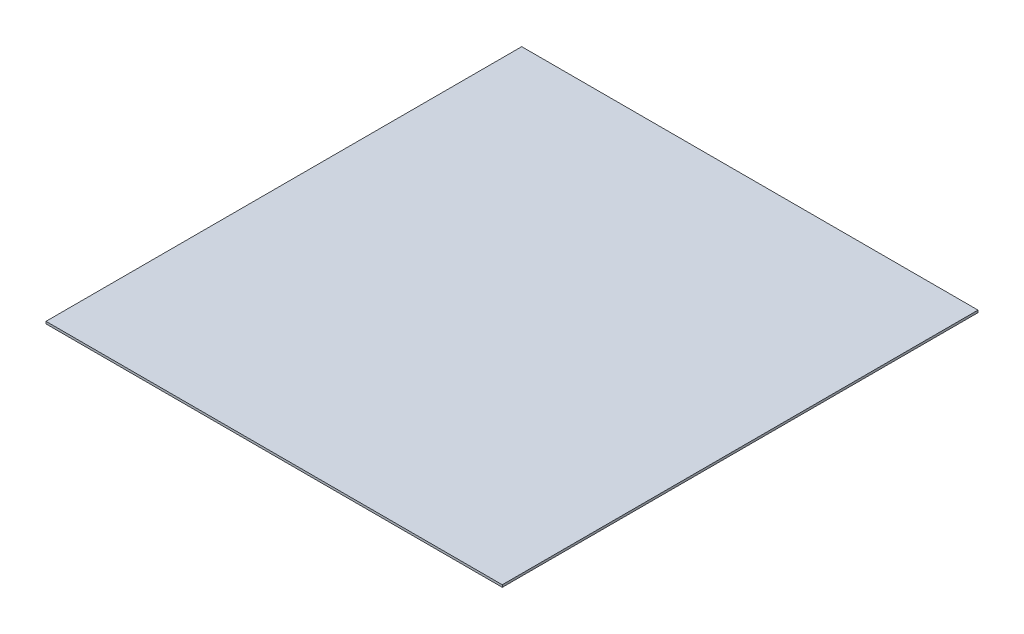
ISO-10303-21;
HEADER;
FILE_DESCRIPTION(('STEP AP214'),'2;1');
FILE_NAME('part.step','',(''),(''),'','','');
FILE_SCHEMA(('AUTOMOTIVE_DESIGN { 1 0 10303 214 1 1 1 1 }'));
ENDSEC;
DATA;
#1=APPLICATION_CONTEXT('core data for automotive mechanical design processes');
#2=APPLICATION_PROTOCOL_DEFINITION('international standard','automotive_design',2000,#1);
#3=PRODUCT_CONTEXT('',#1,'mechanical');
#4=PRODUCT('Part','Part','',(#3));
#5=PRODUCT_RELATED_PRODUCT_CATEGORY('part','',(#4));
#6=PRODUCT_DEFINITION_FORMATION('','',#4);
#7=PRODUCT_DEFINITION_CONTEXT('part definition',#1,'design');
#8=PRODUCT_DEFINITION('design','',#6,#7);
#9=PRODUCT_DEFINITION_SHAPE('','',#8);
#10=(LENGTH_UNIT() NAMED_UNIT(*) SI_UNIT(.MILLI.,.METRE.));
#11=(NAMED_UNIT(*) PLANE_ANGLE_UNIT() SI_UNIT($,.RADIAN.));
#12=(NAMED_UNIT(*) SI_UNIT($,.STERADIAN.) SOLID_ANGLE_UNIT());
#13=UNCERTAINTY_MEASURE_WITH_UNIT(LENGTH_MEASURE(1.E-05),#10,'distance_accuracy_value','');
#14=(GEOMETRIC_REPRESENTATION_CONTEXT(3) GLOBAL_UNCERTAINTY_ASSIGNED_CONTEXT((#13)) GLOBAL_UNIT_ASSIGNED_CONTEXT((#10,
#11,#12)) REPRESENTATION_CONTEXT('',''));
#15=CARTESIAN_POINT('',(0.,0.,0.));
#16=DIRECTION('',(0.,0.,1.));
#17=DIRECTION('',(1.,0.,0.));
#18=AXIS2_PLACEMENT_3D('',#15,#16,#17);
#19=CARTESIAN_POINT('',(0.,0.,0.));
#20=DIRECTION('',(0.,1.,0.));
#21=DIRECTION('',(0.,0.,1.));
#22=AXIS2_PLACEMENT_3D('',#19,#20,#21);
#23=PLANE('',#22);
#24=DIRECTION('',(0.,0.,1.));
#25=VECTOR('',#24,1.);
#26=CARTESIAN_POINT('',(-14.,0.,-183.5));
#27=LINE('',#26,#25);
#28=CARTESIAN_POINT('',(-14.,0.,-183.5));
#29=VERTEX_POINT('',#28);
#30=CARTESIAN_POINT('',(-14.,0.,-181.75));
#31=VERTEX_POINT('',#30);
#32=EDGE_CURVE('E53',#29,#31,#27,.T.);
#33=ORIENTED_EDGE('',*,*,#32,.F.);
#34=DIRECTION('',(-1.,0.,0.));
#35=VECTOR('',#34,1.);
#36=CARTESIAN_POINT('',(-176.,0.,-183.5));
#37=LINE('',#36,#35);
#38=CARTESIAN_POINT('',(176.,0.,-183.5));
#39=VERTEX_POINT('',#38);
#40=EDGE_CURVE('E115',#39,#29,#37,.T.);
#41=ORIENTED_EDGE('',*,*,#40,.F.);
#42=DIRECTION('',(0.,0.,-1.));
#43=VECTOR('',#42,1.);
#44=CARTESIAN_POINT('',(176.,0.,-183.5));
#45=LINE('',#44,#43);
#46=CARTESIAN_POINT('',(176.,0.,183.5));
#47=VERTEX_POINT('',#46);
#48=EDGE_CURVE('E112',#47,#39,#45,.T.);
#49=ORIENTED_EDGE('',*,*,#48,.F.);
#50=DIRECTION('',(1.,0.,0.));
#51=VECTOR('',#50,1.);
#52=CARTESIAN_POINT('',(-176.,0.,183.5));
#53=LINE('',#52,#51);
#54=CARTESIAN_POINT('',(-176.,0.,183.5));
#55=VERTEX_POINT('',#54);
#56=EDGE_CURVE('E125',#55,#47,#53,.T.);
#57=ORIENTED_EDGE('',*,*,#56,.F.);
#58=DIRECTION('',(0.,0.,1.));
#59=VECTOR('',#58,1.);
#60=CARTESIAN_POINT('',(-176.,0.,-183.5));
#61=LINE('',#60,#59);
#62=CARTESIAN_POINT('',(-176.,0.,-181.75));
#63=VERTEX_POINT('',#62);
#64=EDGE_CURVE('E133',#63,#55,#61,.T.);
#65=ORIENTED_EDGE('',*,*,#64,.F.);
#66=DIRECTION('',(-1.,0.,0.));
#67=VECTOR('',#66,1.);
#68=CARTESIAN_POINT('',(-14.,0.,-181.75));
#69=LINE('',#68,#67);
#70=EDGE_CURVE('E48',#31,#63,#69,.T.);
#71=ORIENTED_EDGE('',*,*,#70,.F.);
#72=EDGE_LOOP('',(#33,#41,#49,#57,#65,#71));
#73=FACE_BOUND('',#72,.T.);
#74=ADVANCED_FACE('F33',(#73),#23,.F.);
#75=CARTESIAN_POINT('',(176.,1.75,-183.5));
#76=DIRECTION('',(-1.,0.,0.));
#77=DIRECTION('',(0.,0.,1.));
#78=AXIS2_PLACEMENT_3D('',#75,#76,#77);
#79=PLANE('',#78);
#80=ORIENTED_EDGE('',*,*,#48,.T.);
#81=DIRECTION('',(0.,-1.,0.));
#82=VECTOR('',#81,1.);
#83=CARTESIAN_POINT('',(176.,1.75,-183.5));
#84=LINE('',#83,#82);
#85=CARTESIAN_POINT('',(176.,1.75,-183.5));
#86=VERTEX_POINT('',#85);
#87=EDGE_CURVE('E11',#86,#39,#84,.T.);
#88=ORIENTED_EDGE('',*,*,#87,.F.);
#89=DIRECTION('',(0.,0.,-1.));
#90=VECTOR('',#89,1.);
#91=CARTESIAN_POINT('',(176.,1.75,-183.5));
#92=LINE('',#91,#90);
#93=CARTESIAN_POINT('',(176.,1.75,183.5));
#94=VERTEX_POINT('',#93);
#95=EDGE_CURVE('E121',#94,#86,#92,.T.);
#96=ORIENTED_EDGE('',*,*,#95,.F.);
#97=DIRECTION('',(0.,-1.,0.));
#98=VECTOR('',#97,1.);
#99=CARTESIAN_POINT('',(176.,1.75,183.5));
#100=LINE('',#99,#98);
#101=EDGE_CURVE('E130',#94,#47,#100,.T.);
#102=ORIENTED_EDGE('',*,*,#101,.T.);
#103=EDGE_LOOP('',(#80,#88,#96,#102));
#104=FACE_BOUND('',#103,.T.);
#105=ADVANCED_FACE('F35',(#104),#79,.F.);
#106=CARTESIAN_POINT('',(-176.,1.75,-183.5));
#107=DIRECTION('',(0.,0.,1.));
#108=DIRECTION('',(1.,0.,0.));
#109=AXIS2_PLACEMENT_3D('',#106,#107,#108);
#110=PLANE('',#109);
#111=ORIENTED_EDGE('',*,*,#40,.T.);
#112=DIRECTION('',(0.,1.,0.));
#113=VECTOR('',#112,1.);
#114=CARTESIAN_POINT('',(-14.,-30.,-183.5));
#115=LINE('',#114,#113);
#116=CARTESIAN_POINT('',(-14.,-30.,-183.5));
#117=VERTEX_POINT('',#116);
#118=EDGE_CURVE('E117',#117,#29,#115,.T.);
#119=ORIENTED_EDGE('',*,*,#118,.F.);
#120=DIRECTION('',(1.,0.,0.));
#121=VECTOR('',#120,1.);
#122=CARTESIAN_POINT('',(-14.,-30.,-183.5));
#123=LINE('',#122,#121);
#124=CARTESIAN_POINT('',(-176.,-30.,-183.5));
#125=VERTEX_POINT('',#124);
#126=EDGE_CURVE('E106',#125,#117,#123,.T.);
#127=ORIENTED_EDGE('',*,*,#126,.F.);
#128=DIRECTION('',(0.,-1.,0.));
#129=VECTOR('',#128,1.);
#130=CARTESIAN_POINT('',(-176.,1.75,-183.5));
#131=LINE('',#130,#129);
#132=CARTESIAN_POINT('',(-176.,1.75,-183.5));
#133=VERTEX_POINT('',#132);
#134=EDGE_CURVE('E41',#133,#125,#131,.T.);
#135=ORIENTED_EDGE('',*,*,#134,.F.);
#136=DIRECTION('',(-1.,0.,0.));
#137=VECTOR('',#136,1.);
#138=CARTESIAN_POINT('',(-176.,1.75,-183.5));
#139=LINE('',#138,#137);
#140=EDGE_CURVE('E124',#86,#133,#139,.T.);
#141=ORIENTED_EDGE('',*,*,#140,.F.);
#142=ORIENTED_EDGE('',*,*,#87,.T.);
#143=EDGE_LOOP('',(#111,#119,#127,#135,#141,#142));
#144=FACE_BOUND('',#143,.T.);
#145=ADVANCED_FACE('F147',(#144),#110,.F.);
#146=CARTESIAN_POINT('',(-176.,1.75,-183.5));
#147=DIRECTION('',(1.,0.,0.));
#148=DIRECTION('',(0.,0.,-1.));
#149=AXIS2_PLACEMENT_3D('',#146,#147,#148);
#150=PLANE('',#149);
#151=ORIENTED_EDGE('',*,*,#134,.T.);
#152=DIRECTION('',(0.,0.,-1.));
#153=VECTOR('',#152,1.);
#154=CARTESIAN_POINT('',(-176.,-30.,-183.5));
#155=LINE('',#154,#153);
#156=CARTESIAN_POINT('',(-176.,-30.,-181.75));
#157=VERTEX_POINT('',#156);
#158=EDGE_CURVE('E100',#157,#125,#155,.T.);
#159=ORIENTED_EDGE('',*,*,#158,.F.);
#160=DIRECTION('',(0.,1.,0.));
#161=VECTOR('',#160,1.);
#162=CARTESIAN_POINT('',(-176.,-30.,-181.75));
#163=LINE('',#162,#161);
#164=EDGE_CURVE('E96',#157,#63,#163,.T.);
#165=ORIENTED_EDGE('',*,*,#164,.T.);
#166=ORIENTED_EDGE('',*,*,#64,.T.);
#167=DIRECTION('',(0.,-1.,0.));
#168=VECTOR('',#167,1.);
#169=CARTESIAN_POINT('',(-176.,1.75,183.5));
#170=LINE('',#169,#168);
#171=CARTESIAN_POINT('',(-176.,1.75,183.5));
#172=VERTEX_POINT('',#171);
#173=EDGE_CURVE('E138',#172,#55,#170,.T.);
#174=ORIENTED_EDGE('',*,*,#173,.F.);
#175=DIRECTION('',(0.,0.,1.));
#176=VECTOR('',#175,1.);
#177=CARTESIAN_POINT('',(-176.,1.75,-183.5));
#178=LINE('',#177,#176);
#179=EDGE_CURVE('E127',#133,#172,#178,.T.);
#180=ORIENTED_EDGE('',*,*,#179,.F.);
#181=EDGE_LOOP('',(#151,#159,#165,#166,#174,#180));
#182=FACE_BOUND('',#181,.T.);
#183=ADVANCED_FACE('F143',(#182),#150,.F.);
#184=CARTESIAN_POINT('',(-176.,1.75,183.5));
#185=DIRECTION('',(0.,0.,-1.));
#186=DIRECTION('',(-1.,0.,0.));
#187=AXIS2_PLACEMENT_3D('',#184,#185,#186);
#188=PLANE('',#187);
#189=ORIENTED_EDGE('',*,*,#56,.T.);
#190=ORIENTED_EDGE('',*,*,#101,.F.);
#191=DIRECTION('',(1.,0.,0.));
#192=VECTOR('',#191,1.);
#193=CARTESIAN_POINT('',(-176.,1.75,183.5));
#194=LINE('',#193,#192);
#195=EDGE_CURVE('E129',#172,#94,#194,.T.);
#196=ORIENTED_EDGE('',*,*,#195,.F.);
#197=ORIENTED_EDGE('',*,*,#173,.T.);
#198=EDGE_LOOP('',(#189,#190,#196,#197));
#199=FACE_BOUND('',#198,.T.);
#200=ADVANCED_FACE('F154',(#199),#188,.F.);
#201=CARTESIAN_POINT('',(0.,1.75,0.));
#202=DIRECTION('',(0.,1.,0.));
#203=DIRECTION('',(0.,0.,1.));
#204=AXIS2_PLACEMENT_3D('',#201,#202,#203);
#205=PLANE('',#204);
#206=ORIENTED_EDGE('',*,*,#95,.T.);
#207=ORIENTED_EDGE('',*,*,#140,.T.);
#208=ORIENTED_EDGE('',*,*,#179,.T.);
#209=ORIENTED_EDGE('',*,*,#195,.T.);
#210=EDGE_LOOP('',(#206,#207,#208,#209));
#211=FACE_BOUND('',#210,.T.);
#212=ADVANCED_FACE('F161',(#211),#205,.T.);
#213=CARTESIAN_POINT('',(-14.,-30.,-183.5));
#214=DIRECTION('',(-1.,0.,0.));
#215=DIRECTION('',(0.,0.,1.));
#216=AXIS2_PLACEMENT_3D('',#213,#214,#215);
#217=PLANE('',#216);
#218=ORIENTED_EDGE('',*,*,#32,.T.);
#219=DIRECTION('',(0.,1.,0.));
#220=VECTOR('',#219,1.);
#221=CARTESIAN_POINT('',(-14.,-30.,-181.75));
#222=LINE('',#221,#220);
#223=CARTESIAN_POINT('',(-14.,-30.,-181.75));
#224=VERTEX_POINT('',#223);
#225=EDGE_CURVE('E94',#224,#31,#222,.T.);
#226=ORIENTED_EDGE('',*,*,#225,.F.);
#227=DIRECTION('',(0.,0.,1.));
#228=VECTOR('',#227,1.);
#229=CARTESIAN_POINT('',(-14.,-30.,-183.5));
#230=LINE('',#229,#228);
#231=EDGE_CURVE('E101',#117,#224,#230,.T.);
#232=ORIENTED_EDGE('',*,*,#231,.F.);
#233=ORIENTED_EDGE('',*,*,#118,.T.);
#234=EDGE_LOOP('',(#218,#226,#232,#233));
#235=FACE_BOUND('',#234,.T.);
#236=ADVANCED_FACE('F111',(#235),#217,.F.);
#237=CARTESIAN_POINT('',(-14.,-30.,-181.75));
#238=DIRECTION('',(0.,0.,-1.));
#239=DIRECTION('',(-1.,0.,0.));
#240=AXIS2_PLACEMENT_3D('',#237,#238,#239);
#241=PLANE('',#240);
#242=ORIENTED_EDGE('',*,*,#70,.T.);
#243=ORIENTED_EDGE('',*,*,#164,.F.);
#244=DIRECTION('',(-1.,0.,0.));
#245=VECTOR('',#244,1.);
#246=CARTESIAN_POINT('',(-14.,-30.,-181.75));
#247=LINE('',#246,#245);
#248=EDGE_CURVE('E90',#224,#157,#247,.T.);
#249=ORIENTED_EDGE('',*,*,#248,.F.);
#250=ORIENTED_EDGE('',*,*,#225,.T.);
#251=EDGE_LOOP('',(#242,#243,#249,#250));
#252=FACE_BOUND('',#251,.T.);
#253=ADVANCED_FACE('F92',(#252),#241,.F.);
#254=CARTESIAN_POINT('',(0.,-30.,0.));
#255=DIRECTION('',(0.,-1.,0.));
#256=DIRECTION('',(0.,0.,-1.));
#257=AXIS2_PLACEMENT_3D('',#254,#255,#256);
#258=PLANE('',#257);
#259=ORIENTED_EDGE('',*,*,#231,.T.);
#260=ORIENTED_EDGE('',*,*,#248,.T.);
#261=ORIENTED_EDGE('',*,*,#158,.T.);
#262=ORIENTED_EDGE('',*,*,#126,.T.);
#263=EDGE_LOOP('',(#259,#260,#261,#262));
#264=FACE_BOUND('',#263,.T.);
#265=ADVANCED_FACE('F104',(#264),#258,.T.);
#266=CLOSED_SHELL('',(#74,#105,#145,#183,#200,#212,#236,#253,#265));
#267=MANIFOLD_SOLID_BREP('B2',#266);
#268=ADVANCED_BREP_SHAPE_REPRESENTATION('',(#18,#267),#14);
#269=SHAPE_DEFINITION_REPRESENTATION(#9,#268);
ENDSEC;
END-ISO-10303-21;
